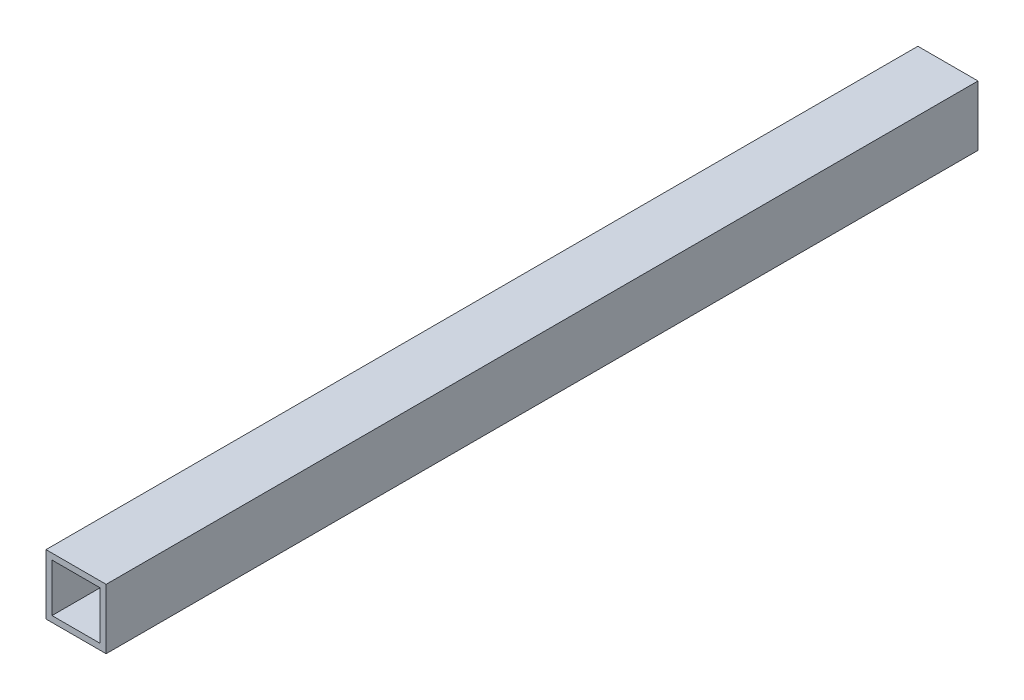
ISO-10303-21;
HEADER;
FILE_DESCRIPTION(('STEP AP214'),'2;1');
FILE_NAME('part.step','',(''),(''),'','','');
FILE_SCHEMA(('AUTOMOTIVE_DESIGN { 1 0 10303 214 1 1 1 1 }'));
ENDSEC;
DATA;
#1=APPLICATION_CONTEXT('core data for automotive mechanical design processes');
#2=APPLICATION_PROTOCOL_DEFINITION('international standard','automotive_design',2000,#1);
#3=PRODUCT_CONTEXT('',#1,'mechanical');
#4=PRODUCT('Part','Part','',(#3));
#5=PRODUCT_RELATED_PRODUCT_CATEGORY('part','',(#4));
#6=PRODUCT_DEFINITION_FORMATION('','',#4);
#7=PRODUCT_DEFINITION_CONTEXT('part definition',#1,'design');
#8=PRODUCT_DEFINITION('design','',#6,#7);
#9=PRODUCT_DEFINITION_SHAPE('','',#8);
#10=(LENGTH_UNIT() NAMED_UNIT(*) SI_UNIT(.MILLI.,.METRE.));
#11=(NAMED_UNIT(*) PLANE_ANGLE_UNIT() SI_UNIT($,.RADIAN.));
#12=(NAMED_UNIT(*) SI_UNIT($,.STERADIAN.) SOLID_ANGLE_UNIT());
#13=UNCERTAINTY_MEASURE_WITH_UNIT(LENGTH_MEASURE(1.E-05),#10,'distance_accuracy_value','');
#14=(GEOMETRIC_REPRESENTATION_CONTEXT(3) GLOBAL_UNCERTAINTY_ASSIGNED_CONTEXT((#13)) GLOBAL_UNIT_ASSIGNED_CONTEXT((#10,
#11,#12)) REPRESENTATION_CONTEXT('',''));
#15=CARTESIAN_POINT('',(0.,0.,0.));
#16=DIRECTION('',(0.,0.,1.));
#17=DIRECTION('',(1.,0.,0.));
#18=AXIS2_PLACEMENT_3D('',#15,#16,#17);
#19=CARTESIAN_POINT('',(0.,0.,184.15));
#20=DIRECTION('',(0.,0.,-1.));
#21=DIRECTION('',(-1.,0.,0.));
#22=AXIS2_PLACEMENT_3D('',#19,#20,#21);
#23=PLANE('',#22);
#24=DIRECTION('',(0.,1.,0.));
#25=VECTOR('',#24,1.);
#26=CARTESIAN_POINT('',(12.7,-12.7,184.15));
#27=LINE('',#26,#25);
#28=CARTESIAN_POINT('',(12.7,-12.7,184.15));
#29=VERTEX_POINT('',#28);
#30=CARTESIAN_POINT('',(12.7,12.7,184.15));
#31=VERTEX_POINT('',#30);
#32=EDGE_CURVE('E153',#29,#31,#27,.T.);
#33=ORIENTED_EDGE('',*,*,#32,.T.);
#34=DIRECTION('',(-1.,0.,0.));
#35=VECTOR('',#34,1.);
#36=CARTESIAN_POINT('',(-12.7,12.7,184.15));
#37=LINE('',#36,#35);
#38=CARTESIAN_POINT('',(-12.7,12.7,184.15));
#39=VERTEX_POINT('',#38);
#40=EDGE_CURVE('E157',#31,#39,#37,.T.);
#41=ORIENTED_EDGE('',*,*,#40,.T.);
#42=DIRECTION('',(0.,-1.,0.));
#43=VECTOR('',#42,1.);
#44=CARTESIAN_POINT('',(-12.7,-12.7,184.15));
#45=LINE('',#44,#43);
#46=CARTESIAN_POINT('',(-12.7,-12.7,184.15));
#47=VERTEX_POINT('',#46);
#48=EDGE_CURVE('E161',#39,#47,#45,.T.);
#49=ORIENTED_EDGE('',*,*,#48,.T.);
#50=DIRECTION('',(1.,0.,0.));
#51=VECTOR('',#50,1.);
#52=CARTESIAN_POINT('',(-12.7,-12.7,184.15));
#53=LINE('',#52,#51);
#54=EDGE_CURVE('E164',#47,#29,#53,.T.);
#55=ORIENTED_EDGE('',*,*,#54,.T.);
#56=EDGE_LOOP('',(#33,#41,#49,#55));
#57=FACE_BOUND('',#56,.T.);
#58=DIRECTION('',(1.,0.,0.));
#59=VECTOR('',#58,1.);
#60=CARTESIAN_POINT('',(-10.16,-10.16,184.15));
#61=LINE('',#60,#59);
#62=CARTESIAN_POINT('',(-10.16,-10.16,184.15));
#63=VERTEX_POINT('',#62);
#64=CARTESIAN_POINT('',(10.16,-10.16,184.15));
#65=VERTEX_POINT('',#64);
#66=EDGE_CURVE('E105',#63,#65,#61,.T.);
#67=ORIENTED_EDGE('',*,*,#66,.F.);
#68=DIRECTION('',(0.,-1.,0.));
#69=VECTOR('',#68,1.);
#70=CARTESIAN_POINT('',(-10.16,-10.16,184.15));
#71=LINE('',#70,#69);
#72=CARTESIAN_POINT('',(-10.16,10.16,184.15));
#73=VERTEX_POINT('',#72);
#74=EDGE_CURVE('E131',#73,#63,#71,.T.);
#75=ORIENTED_EDGE('',*,*,#74,.F.);
#76=DIRECTION('',(-1.,0.,0.));
#77=VECTOR('',#76,1.);
#78=CARTESIAN_POINT('',(-10.16,10.16,184.15));
#79=LINE('',#78,#77);
#80=CARTESIAN_POINT('',(10.16,10.16,184.15));
#81=VERTEX_POINT('',#80);
#82=EDGE_CURVE('E127',#81,#73,#79,.T.);
#83=ORIENTED_EDGE('',*,*,#82,.F.);
#84=DIRECTION('',(0.,1.,0.));
#85=VECTOR('',#84,1.);
#86=CARTESIAN_POINT('',(10.16,-10.16,184.15));
#87=LINE('',#86,#85);
#88=EDGE_CURVE('E114',#65,#81,#87,.T.);
#89=ORIENTED_EDGE('',*,*,#88,.F.);
#90=EDGE_LOOP('',(#67,#75,#83,#89));
#91=FACE_BOUND('',#90,.T.);
#92=ADVANCED_FACE('F39',(#57,#91),#23,.F.);
#93=CARTESIAN_POINT('',(0.,0.,-184.15));
#94=DIRECTION('',(0.,0.,-1.));
#95=DIRECTION('',(-1.,0.,0.));
#96=AXIS2_PLACEMENT_3D('',#93,#94,#95);
#97=PLANE('',#96);
#98=DIRECTION('',(0.,1.,0.));
#99=VECTOR('',#98,1.);
#100=CARTESIAN_POINT('',(12.7,-12.7,-184.15));
#101=LINE('',#100,#99);
#102=CARTESIAN_POINT('',(12.7,-12.7,-184.15));
#103=VERTEX_POINT('',#102);
#104=CARTESIAN_POINT('',(12.7,12.7,-184.15));
#105=VERTEX_POINT('',#104);
#106=EDGE_CURVE('E123',#103,#105,#101,.T.);
#107=ORIENTED_EDGE('',*,*,#106,.F.);
#108=DIRECTION('',(1.,0.,0.));
#109=VECTOR('',#108,1.);
#110=CARTESIAN_POINT('',(-12.7,-12.7,-184.15));
#111=LINE('',#110,#109);
#112=CARTESIAN_POINT('',(-12.7,-12.7,-184.15));
#113=VERTEX_POINT('',#112);
#114=EDGE_CURVE('E158',#113,#103,#111,.T.);
#115=ORIENTED_EDGE('',*,*,#114,.F.);
#116=DIRECTION('',(0.,-1.,0.));
#117=VECTOR('',#116,1.);
#118=CARTESIAN_POINT('',(-12.7,-12.7,-184.15));
#119=LINE('',#118,#117);
#120=CARTESIAN_POINT('',(-12.7,12.7,-184.15));
#121=VERTEX_POINT('',#120);
#122=EDGE_CURVE('E174',#121,#113,#119,.T.);
#123=ORIENTED_EDGE('',*,*,#122,.F.);
#124=DIRECTION('',(-1.,0.,0.));
#125=VECTOR('',#124,1.);
#126=CARTESIAN_POINT('',(-12.7,12.7,-184.15));
#127=LINE('',#126,#125);
#128=EDGE_CURVE('E171',#105,#121,#127,.T.);
#129=ORIENTED_EDGE('',*,*,#128,.F.);
#130=EDGE_LOOP('',(#107,#115,#123,#129));
#131=FACE_BOUND('',#130,.T.);
#132=DIRECTION('',(0.,-1.,0.));
#133=VECTOR('',#132,1.);
#134=CARTESIAN_POINT('',(-10.16,-10.16,-184.15));
#135=LINE('',#134,#133);
#136=CARTESIAN_POINT('',(-10.16,10.16,-184.15));
#137=VERTEX_POINT('',#136);
#138=CARTESIAN_POINT('',(-10.16,-10.16,-184.15));
#139=VERTEX_POINT('',#138);
#140=EDGE_CURVE('E115',#137,#139,#135,.T.);
#141=ORIENTED_EDGE('',*,*,#140,.T.);
#142=DIRECTION('',(1.,0.,0.));
#143=VECTOR('',#142,1.);
#144=CARTESIAN_POINT('',(-10.16,-10.16,-184.15));
#145=LINE('',#144,#143);
#146=CARTESIAN_POINT('',(10.16,-10.16,-184.15));
#147=VERTEX_POINT('',#146);
#148=EDGE_CURVE('E63',#139,#147,#145,.T.);
#149=ORIENTED_EDGE('',*,*,#148,.T.);
#150=DIRECTION('',(0.,1.,0.));
#151=VECTOR('',#150,1.);
#152=CARTESIAN_POINT('',(10.16,-10.16,-184.15));
#153=LINE('',#152,#151);
#154=CARTESIAN_POINT('',(10.16,10.16,-184.15));
#155=VERTEX_POINT('',#154);
#156=EDGE_CURVE('E121',#147,#155,#153,.T.);
#157=ORIENTED_EDGE('',*,*,#156,.T.);
#158=DIRECTION('',(-1.,0.,0.));
#159=VECTOR('',#158,1.);
#160=CARTESIAN_POINT('',(-10.16,10.16,-184.15));
#161=LINE('',#160,#159);
#162=EDGE_CURVE('E140',#155,#137,#161,.T.);
#163=ORIENTED_EDGE('',*,*,#162,.T.);
#164=EDGE_LOOP('',(#141,#149,#157,#163));
#165=FACE_BOUND('',#164,.T.);
#166=ADVANCED_FACE('F197',(#131,#165),#97,.T.);
#167=CARTESIAN_POINT('',(12.7,-12.7,184.15));
#168=DIRECTION('',(-1.,0.,0.));
#169=DIRECTION('',(0.,0.,1.));
#170=AXIS2_PLACEMENT_3D('',#167,#168,#169);
#171=PLANE('',#170);
#172=ORIENTED_EDGE('',*,*,#106,.T.);
#173=DIRECTION('',(0.,0.,-1.));
#174=VECTOR('',#173,1.);
#175=CARTESIAN_POINT('',(12.7,12.7,184.15));
#176=LINE('',#175,#174);
#177=EDGE_CURVE('E11',#31,#105,#176,.T.);
#178=ORIENTED_EDGE('',*,*,#177,.F.);
#179=ORIENTED_EDGE('',*,*,#32,.F.);
#180=DIRECTION('',(0.,0.,-1.));
#181=VECTOR('',#180,1.);
#182=CARTESIAN_POINT('',(12.7,-12.7,184.15));
#183=LINE('',#182,#181);
#184=EDGE_CURVE('E167',#29,#103,#183,.T.);
#185=ORIENTED_EDGE('',*,*,#184,.T.);
#186=EDGE_LOOP('',(#172,#178,#179,#185));
#187=FACE_BOUND('',#186,.T.);
#188=ADVANCED_FACE('F41',(#187),#171,.F.);
#189=CARTESIAN_POINT('',(-12.7,12.7,184.15));
#190=DIRECTION('',(0.,-1.,0.));
#191=DIRECTION('',(0.,0.,-1.));
#192=AXIS2_PLACEMENT_3D('',#189,#190,#191);
#193=PLANE('',#192);
#194=ORIENTED_EDGE('',*,*,#128,.T.);
#195=DIRECTION('',(0.,0.,-1.));
#196=VECTOR('',#195,1.);
#197=CARTESIAN_POINT('',(-12.7,12.7,184.15));
#198=LINE('',#197,#196);
#199=EDGE_CURVE('E48',#39,#121,#198,.T.);
#200=ORIENTED_EDGE('',*,*,#199,.F.);
#201=ORIENTED_EDGE('',*,*,#40,.F.);
#202=ORIENTED_EDGE('',*,*,#177,.T.);
#203=EDGE_LOOP('',(#194,#200,#201,#202));
#204=FACE_BOUND('',#203,.T.);
#205=ADVANCED_FACE('F207',(#204),#193,.F.);
#206=CARTESIAN_POINT('',(-12.7,-12.7,184.15));
#207=DIRECTION('',(1.,0.,0.));
#208=DIRECTION('',(0.,0.,-1.));
#209=AXIS2_PLACEMENT_3D('',#206,#207,#208);
#210=PLANE('',#209);
#211=ORIENTED_EDGE('',*,*,#122,.T.);
#212=DIRECTION('',(0.,0.,-1.));
#213=VECTOR('',#212,1.);
#214=CARTESIAN_POINT('',(-12.7,-12.7,184.15));
#215=LINE('',#214,#213);
#216=EDGE_CURVE('E182',#47,#113,#215,.T.);
#217=ORIENTED_EDGE('',*,*,#216,.F.);
#218=ORIENTED_EDGE('',*,*,#48,.F.);
#219=ORIENTED_EDGE('',*,*,#199,.T.);
#220=EDGE_LOOP('',(#211,#217,#218,#219));
#221=FACE_BOUND('',#220,.T.);
#222=ADVANCED_FACE('F191',(#221),#210,.F.);
#223=CARTESIAN_POINT('',(-12.7,-12.7,184.15));
#224=DIRECTION('',(0.,1.,0.));
#225=DIRECTION('',(0.,0.,1.));
#226=AXIS2_PLACEMENT_3D('',#223,#224,#225);
#227=PLANE('',#226);
#228=ORIENTED_EDGE('',*,*,#114,.T.);
#229=ORIENTED_EDGE('',*,*,#184,.F.);
#230=ORIENTED_EDGE('',*,*,#54,.F.);
#231=ORIENTED_EDGE('',*,*,#216,.T.);
#232=EDGE_LOOP('',(#228,#229,#230,#231));
#233=FACE_BOUND('',#232,.T.);
#234=ADVANCED_FACE('F201',(#233),#227,.F.);
#235=CARTESIAN_POINT('',(-10.16,-10.16,184.15));
#236=DIRECTION('',(0.,1.,0.));
#237=DIRECTION('',(0.,0.,1.));
#238=AXIS2_PLACEMENT_3D('',#235,#236,#237);
#239=PLANE('',#238);
#240=ORIENTED_EDGE('',*,*,#148,.F.);
#241=DIRECTION('',(0.,0.,-1.));
#242=VECTOR('',#241,1.);
#243=CARTESIAN_POINT('',(-10.16,-10.16,184.15));
#244=LINE('',#243,#242);
#245=EDGE_CURVE('E109',#63,#139,#244,.T.);
#246=ORIENTED_EDGE('',*,*,#245,.F.);
#247=ORIENTED_EDGE('',*,*,#66,.T.);
#248=DIRECTION('',(0.,0.,-1.));
#249=VECTOR('',#248,1.);
#250=CARTESIAN_POINT('',(10.16,-10.16,184.15));
#251=LINE('',#250,#249);
#252=EDGE_CURVE('E108',#65,#147,#251,.T.);
#253=ORIENTED_EDGE('',*,*,#252,.T.);
#254=EDGE_LOOP('',(#240,#246,#247,#253));
#255=FACE_BOUND('',#254,.T.);
#256=ADVANCED_FACE('F107',(#255),#239,.T.);
#257=CARTESIAN_POINT('',(10.16,-10.16,184.15));
#258=DIRECTION('',(-1.,0.,0.));
#259=DIRECTION('',(0.,0.,1.));
#260=AXIS2_PLACEMENT_3D('',#257,#258,#259);
#261=PLANE('',#260);
#262=ORIENTED_EDGE('',*,*,#156,.F.);
#263=ORIENTED_EDGE('',*,*,#252,.F.);
#264=ORIENTED_EDGE('',*,*,#88,.T.);
#265=DIRECTION('',(0.,0.,-1.));
#266=VECTOR('',#265,1.);
#267=CARTESIAN_POINT('',(10.16,10.16,184.15));
#268=LINE('',#267,#266);
#269=EDGE_CURVE('E124',#81,#155,#268,.T.);
#270=ORIENTED_EDGE('',*,*,#269,.T.);
#271=EDGE_LOOP('',(#262,#263,#264,#270));
#272=FACE_BOUND('',#271,.T.);
#273=ADVANCED_FACE('F118',(#272),#261,.T.);
#274=CARTESIAN_POINT('',(-10.16,10.16,184.15));
#275=DIRECTION('',(0.,-1.,0.));
#276=DIRECTION('',(0.,0.,-1.));
#277=AXIS2_PLACEMENT_3D('',#274,#275,#276);
#278=PLANE('',#277);
#279=ORIENTED_EDGE('',*,*,#162,.F.);
#280=ORIENTED_EDGE('',*,*,#269,.F.);
#281=ORIENTED_EDGE('',*,*,#82,.T.);
#282=DIRECTION('',(0.,0.,-1.));
#283=VECTOR('',#282,1.);
#284=CARTESIAN_POINT('',(-10.16,10.16,184.15));
#285=LINE('',#284,#283);
#286=EDGE_CURVE('E55',#73,#137,#285,.T.);
#287=ORIENTED_EDGE('',*,*,#286,.T.);
#288=EDGE_LOOP('',(#279,#280,#281,#287));
#289=FACE_BOUND('',#288,.T.);
#290=ADVANCED_FACE('F230',(#289),#278,.T.);
#291=CARTESIAN_POINT('',(-10.16,-10.16,184.15));
#292=DIRECTION('',(1.,0.,0.));
#293=DIRECTION('',(0.,0.,-1.));
#294=AXIS2_PLACEMENT_3D('',#291,#292,#293);
#295=PLANE('',#294);
#296=ORIENTED_EDGE('',*,*,#140,.F.);
#297=ORIENTED_EDGE('',*,*,#286,.F.);
#298=ORIENTED_EDGE('',*,*,#74,.T.);
#299=ORIENTED_EDGE('',*,*,#245,.T.);
#300=EDGE_LOOP('',(#296,#297,#298,#299));
#301=FACE_BOUND('',#300,.T.);
#302=ADVANCED_FACE('F234',(#301),#295,.T.);
#303=CLOSED_SHELL('',(#92,#166,#188,#205,#222,#234,#256,#273,#290,#302));
#304=MANIFOLD_SOLID_BREP('B2',#303);
#305=ADVANCED_BREP_SHAPE_REPRESENTATION('',(#18,#304),#14);
#306=SHAPE_DEFINITION_REPRESENTATION(#9,#305);
ENDSEC;
END-ISO-10303-21;
